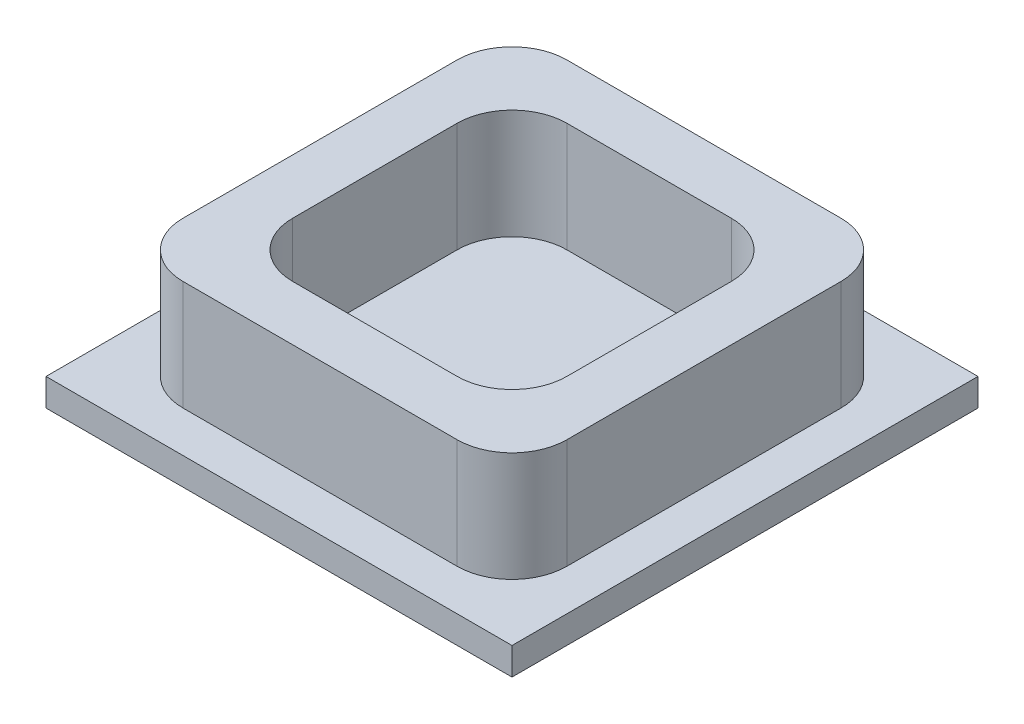
ISO-10303-21;
HEADER;
FILE_DESCRIPTION(('STEP AP214'),'2;1');
FILE_NAME('part.step','',(''),(''),'','','');
FILE_SCHEMA(('AUTOMOTIVE_DESIGN { 1 0 10303 214 1 1 1 1 }'));
ENDSEC;
DATA;
#1=APPLICATION_CONTEXT('core data for automotive mechanical design processes');
#2=APPLICATION_PROTOCOL_DEFINITION('international standard','automotive_design',2000,#1);
#3=PRODUCT_CONTEXT('',#1,'mechanical');
#4=PRODUCT('Part','Part','',(#3));
#5=PRODUCT_RELATED_PRODUCT_CATEGORY('part','',(#4));
#6=PRODUCT_DEFINITION_FORMATION('','',#4);
#7=PRODUCT_DEFINITION_CONTEXT('part definition',#1,'design');
#8=PRODUCT_DEFINITION('design','',#6,#7);
#9=PRODUCT_DEFINITION_SHAPE('','',#8);
#10=(LENGTH_UNIT() NAMED_UNIT(*) SI_UNIT(.MILLI.,.METRE.));
#11=(NAMED_UNIT(*) PLANE_ANGLE_UNIT() SI_UNIT($,.RADIAN.));
#12=(NAMED_UNIT(*) SI_UNIT($,.STERADIAN.) SOLID_ANGLE_UNIT());
#13=UNCERTAINTY_MEASURE_WITH_UNIT(LENGTH_MEASURE(1.E-05),#10,'distance_accuracy_value','');
#14=(GEOMETRIC_REPRESENTATION_CONTEXT(3) GLOBAL_UNCERTAINTY_ASSIGNED_CONTEXT((#13)) GLOBAL_UNIT_ASSIGNED_CONTEXT((#10,
#11,#12)) REPRESENTATION_CONTEXT('',''));
#15=CARTESIAN_POINT('',(0.,0.,0.));
#16=DIRECTION('',(0.,0.,1.));
#17=DIRECTION('',(1.,0.,0.));
#18=AXIS2_PLACEMENT_3D('',#15,#16,#17);
#19=CARTESIAN_POINT('',(0.,1.,0.));
#20=DIRECTION('',(0.,1.,0.));
#21=DIRECTION('',(0.,0.,1.));
#22=AXIS2_PLACEMENT_3D('',#19,#20,#21);
#23=PLANE('',#22);
#24=DIRECTION('',(0.,0.,1.));
#25=VECTOR('',#24,1.);
#26=CARTESIAN_POINT('',(-8.5,1.,8.5));
#27=LINE('',#26,#25);
#28=CARTESIAN_POINT('',(-8.5,1.,-8.5));
#29=VERTEX_POINT('',#28);
#30=CARTESIAN_POINT('',(-8.5,1.,8.5));
#31=VERTEX_POINT('',#30);
#32=EDGE_CURVE('E180',#29,#31,#27,.T.);
#33=ORIENTED_EDGE('',*,*,#32,.T.);
#34=DIRECTION('',(1.,0.,0.));
#35=VECTOR('',#34,1.);
#36=CARTESIAN_POINT('',(8.5,1.,8.5));
#37=LINE('',#36,#35);
#38=CARTESIAN_POINT('',(8.5,1.,8.5));
#39=VERTEX_POINT('',#38);
#40=EDGE_CURVE('E169',#31,#39,#37,.T.);
#41=ORIENTED_EDGE('',*,*,#40,.T.);
#42=DIRECTION('',(0.,0.,-1.));
#43=VECTOR('',#42,1.);
#44=CARTESIAN_POINT('',(8.5,1.,8.5));
#45=LINE('',#44,#43);
#46=CARTESIAN_POINT('',(8.5,1.,-8.5));
#47=VERTEX_POINT('',#46);
#48=EDGE_CURVE('E179',#39,#47,#45,.T.);
#49=ORIENTED_EDGE('',*,*,#48,.T.);
#50=DIRECTION('',(-1.,0.,0.));
#51=VECTOR('',#50,1.);
#52=CARTESIAN_POINT('',(8.5,1.,-8.5));
#53=LINE('',#52,#51);
#54=EDGE_CURVE('E184',#47,#29,#53,.T.);
#55=ORIENTED_EDGE('',*,*,#54,.T.);
#56=EDGE_LOOP('',(#33,#41,#49,#55));
#57=FACE_BOUND('',#56,.T.);
#58=DIRECTION('',(-1.,0.,0.));
#59=VECTOR('',#58,1.);
#60=CARTESIAN_POINT('',(-7.,1.,-7.));
#61=LINE('',#60,#59);
#62=CARTESIAN_POINT('',(5.,1.,-7.));
#63=VERTEX_POINT('',#62);
#64=CARTESIAN_POINT('',(-5.,1.,-7.));
#65=VERTEX_POINT('',#64);
#66=EDGE_CURVE('E267',#63,#65,#61,.T.);
#67=ORIENTED_EDGE('',*,*,#66,.F.);
#68=CARTESIAN_POINT('',(5.,1.,-5.));
#69=DIRECTION('',(0.,1.,0.));
#70=DIRECTION('',(0.,0.,1.));
#71=AXIS2_PLACEMENT_3D('',#68,#69,#70);
#72=CIRCLE('',#71,2.);
#73=CARTESIAN_POINT('',(7.,1.,-5.));
#74=VERTEX_POINT('',#73);
#75=EDGE_CURVE('E41',#63,#74,#72,.F.);
#76=ORIENTED_EDGE('',*,*,#75,.T.);
#77=DIRECTION('',(0.,0.,-1.));
#78=VECTOR('',#77,1.);
#79=CARTESIAN_POINT('',(7.,1.,-7.));
#80=LINE('',#79,#78);
#81=CARTESIAN_POINT('',(7.,1.,5.));
#82=VERTEX_POINT('',#81);
#83=EDGE_CURVE('E266',#82,#74,#80,.T.);
#84=ORIENTED_EDGE('',*,*,#83,.F.);
#85=CARTESIAN_POINT('',(5.,1.,5.));
#86=DIRECTION('',(0.,1.,0.));
#87=DIRECTION('',(0.,0.,1.));
#88=AXIS2_PLACEMENT_3D('',#85,#86,#87);
#89=CIRCLE('',#88,2.);
#90=CARTESIAN_POINT('',(5.,1.,7.));
#91=VERTEX_POINT('',#90);
#92=EDGE_CURVE('E263',#82,#91,#89,.F.);
#93=ORIENTED_EDGE('',*,*,#92,.T.);
#94=DIRECTION('',(1.,0.,0.));
#95=VECTOR('',#94,1.);
#96=CARTESIAN_POINT('',(-7.,1.,7.));
#97=LINE('',#96,#95);
#98=CARTESIAN_POINT('',(-5.,1.,7.));
#99=VERTEX_POINT('',#98);
#100=EDGE_CURVE('E293',#99,#91,#97,.T.);
#101=ORIENTED_EDGE('',*,*,#100,.F.);
#102=CARTESIAN_POINT('',(-5.,1.,5.));
#103=DIRECTION('',(0.,1.,0.));
#104=DIRECTION('',(0.,0.,1.));
#105=AXIS2_PLACEMENT_3D('',#102,#103,#104);
#106=CIRCLE('',#105,2.);
#107=CARTESIAN_POINT('',(-7.,1.,5.));
#108=VERTEX_POINT('',#107);
#109=EDGE_CURVE('E261',#99,#108,#106,.F.);
#110=ORIENTED_EDGE('',*,*,#109,.T.);
#111=DIRECTION('',(0.,0.,1.));
#112=VECTOR('',#111,1.);
#113=CARTESIAN_POINT('',(-7.,1.,-7.));
#114=LINE('',#113,#112);
#115=CARTESIAN_POINT('',(-7.,1.,-5.));
#116=VERTEX_POINT('',#115);
#117=EDGE_CURVE('E300',#116,#108,#114,.T.);
#118=ORIENTED_EDGE('',*,*,#117,.F.);
#119=CARTESIAN_POINT('',(-5.,1.,-5.));
#120=DIRECTION('',(0.,1.,0.));
#121=DIRECTION('',(0.,0.,1.));
#122=AXIS2_PLACEMENT_3D('',#119,#120,#121);
#123=CIRCLE('',#122,2.);
#124=EDGE_CURVE('E11',#116,#65,#123,.F.);
#125=ORIENTED_EDGE('',*,*,#124,.T.);
#126=EDGE_LOOP('',(#67,#76,#84,#93,#101,#110,#118,#125));
#127=FACE_BOUND('',#126,.T.);
#128=ADVANCED_FACE('F33',(#57,#127),#23,.T.);
#129=CARTESIAN_POINT('',(-8.5,1.,8.5));
#130=DIRECTION('',(1.,0.,0.));
#131=DIRECTION('',(0.,0.,-1.));
#132=AXIS2_PLACEMENT_3D('',#129,#130,#131);
#133=PLANE('',#132);
#134=DIRECTION('',(0.,0.,1.));
#135=VECTOR('',#134,1.);
#136=CARTESIAN_POINT('',(-8.5,0.,8.5));
#137=LINE('',#136,#135);
#138=CARTESIAN_POINT('',(-8.5,0.,-8.5));
#139=VERTEX_POINT('',#138);
#140=CARTESIAN_POINT('',(-8.5,0.,8.5));
#141=VERTEX_POINT('',#140);
#142=EDGE_CURVE('E192',#139,#141,#137,.T.);
#143=ORIENTED_EDGE('',*,*,#142,.T.);
#144=DIRECTION('',(0.,-1.,0.));
#145=VECTOR('',#144,1.);
#146=CARTESIAN_POINT('',(-8.5,1.,8.5));
#147=LINE('',#146,#145);
#148=EDGE_CURVE('E173',#31,#141,#147,.T.);
#149=ORIENTED_EDGE('',*,*,#148,.F.);
#150=ORIENTED_EDGE('',*,*,#32,.F.);
#151=DIRECTION('',(0.,-1.,0.));
#152=VECTOR('',#151,1.);
#153=CARTESIAN_POINT('',(-8.5,1.,-8.5));
#154=LINE('',#153,#152);
#155=EDGE_CURVE('E307',#29,#139,#154,.T.);
#156=ORIENTED_EDGE('',*,*,#155,.T.);
#157=EDGE_LOOP('',(#143,#149,#150,#156));
#158=FACE_BOUND('',#157,.T.);
#159=ADVANCED_FACE('F190',(#158),#133,.F.);
#160=CARTESIAN_POINT('',(8.5,1.,8.5));
#161=DIRECTION('',(0.,0.,-1.));
#162=DIRECTION('',(-1.,0.,0.));
#163=AXIS2_PLACEMENT_3D('',#160,#161,#162);
#164=PLANE('',#163);
#165=DIRECTION('',(1.,0.,0.));
#166=VECTOR('',#165,1.);
#167=CARTESIAN_POINT('',(8.5,0.,8.5));
#168=LINE('',#167,#166);
#169=CARTESIAN_POINT('',(8.5,0.,8.5));
#170=VERTEX_POINT('',#169);
#171=EDGE_CURVE('E309',#141,#170,#168,.T.);
#172=ORIENTED_EDGE('',*,*,#171,.T.);
#173=DIRECTION('',(0.,-1.,0.));
#174=VECTOR('',#173,1.);
#175=CARTESIAN_POINT('',(8.5,1.,8.5));
#176=LINE('',#175,#174);
#177=EDGE_CURVE('E176',#39,#170,#176,.T.);
#178=ORIENTED_EDGE('',*,*,#177,.F.);
#179=ORIENTED_EDGE('',*,*,#40,.F.);
#180=ORIENTED_EDGE('',*,*,#148,.T.);
#181=EDGE_LOOP('',(#172,#178,#179,#180));
#182=FACE_BOUND('',#181,.T.);
#183=ADVANCED_FACE('F171',(#182),#164,.F.);
#184=CARTESIAN_POINT('',(8.5,1.,8.5));
#185=DIRECTION('',(-1.,0.,0.));
#186=DIRECTION('',(0.,0.,1.));
#187=AXIS2_PLACEMENT_3D('',#184,#185,#186);
#188=PLANE('',#187);
#189=DIRECTION('',(0.,0.,-1.));
#190=VECTOR('',#189,1.);
#191=CARTESIAN_POINT('',(8.5,0.,8.5));
#192=LINE('',#191,#190);
#193=CARTESIAN_POINT('',(8.5,0.,-8.5));
#194=VERTEX_POINT('',#193);
#195=EDGE_CURVE('E311',#170,#194,#192,.T.);
#196=ORIENTED_EDGE('',*,*,#195,.T.);
#197=DIRECTION('',(0.,-1.,0.));
#198=VECTOR('',#197,1.);
#199=CARTESIAN_POINT('',(8.5,1.,-8.5));
#200=LINE('',#199,#198);
#201=EDGE_CURVE('E197',#47,#194,#200,.T.);
#202=ORIENTED_EDGE('',*,*,#201,.F.);
#203=ORIENTED_EDGE('',*,*,#48,.F.);
#204=ORIENTED_EDGE('',*,*,#177,.T.);
#205=EDGE_LOOP('',(#196,#202,#203,#204));
#206=FACE_BOUND('',#205,.T.);
#207=ADVANCED_FACE('F323',(#206),#188,.F.);
#208=CARTESIAN_POINT('',(8.5,1.,-8.5));
#209=DIRECTION('',(0.,0.,1.));
#210=DIRECTION('',(1.,0.,0.));
#211=AXIS2_PLACEMENT_3D('',#208,#209,#210);
#212=PLANE('',#211);
#213=DIRECTION('',(-1.,0.,0.));
#214=VECTOR('',#213,1.);
#215=CARTESIAN_POINT('',(8.5,0.,-8.5));
#216=LINE('',#215,#214);
#217=EDGE_CURVE('E188',#194,#139,#216,.T.);
#218=ORIENTED_EDGE('',*,*,#217,.T.);
#219=ORIENTED_EDGE('',*,*,#155,.F.);
#220=ORIENTED_EDGE('',*,*,#54,.F.);
#221=ORIENTED_EDGE('',*,*,#201,.T.);
#222=EDGE_LOOP('',(#218,#219,#220,#221));
#223=FACE_BOUND('',#222,.T.);
#224=ADVANCED_FACE('F318',(#223),#212,.F.);
#225=CARTESIAN_POINT('',(0.,0.,0.));
#226=DIRECTION('',(0.,1.,0.));
#227=DIRECTION('',(0.,0.,1.));
#228=AXIS2_PLACEMENT_3D('',#225,#226,#227);
#229=PLANE('',#228);
#230=ORIENTED_EDGE('',*,*,#142,.F.);
#231=ORIENTED_EDGE('',*,*,#217,.F.);
#232=ORIENTED_EDGE('',*,*,#195,.F.);
#233=ORIENTED_EDGE('',*,*,#171,.F.);
#234=EDGE_LOOP('',(#230,#231,#232,#233));
#235=FACE_BOUND('',#234,.T.);
#236=ADVANCED_FACE('F322',(#235),#229,.F.);
#237=CARTESIAN_POINT('',(0.,5.,0.));
#238=DIRECTION('',(0.,1.,0.));
#239=DIRECTION('',(0.,0.,1.));
#240=AXIS2_PLACEMENT_3D('',#237,#238,#239);
#241=PLANE('',#240);
#242=DIRECTION('',(0.,0.,1.));
#243=VECTOR('',#242,1.);
#244=CARTESIAN_POINT('',(-7.,5.,-7.));
#245=LINE('',#244,#243);
#246=CARTESIAN_POINT('',(-7.,5.,-5.));
#247=VERTEX_POINT('',#246);
#248=CARTESIAN_POINT('',(-7.,5.,5.));
#249=VERTEX_POINT('',#248);
#250=EDGE_CURVE('E289',#247,#249,#245,.T.);
#251=ORIENTED_EDGE('',*,*,#250,.T.);
#252=CARTESIAN_POINT('',(-5.,5.,5.));
#253=DIRECTION('',(0.,1.,0.));
#254=DIRECTION('',(0.,0.,1.));
#255=AXIS2_PLACEMENT_3D('',#252,#253,#254);
#256=CIRCLE('',#255,2.);
#257=CARTESIAN_POINT('',(-5.,5.,7.));
#258=VERTEX_POINT('',#257);
#259=EDGE_CURVE('E242',#249,#258,#256,.T.);
#260=ORIENTED_EDGE('',*,*,#259,.T.);
#261=DIRECTION('',(1.,0.,0.));
#262=VECTOR('',#261,1.);
#263=CARTESIAN_POINT('',(-7.,5.,7.));
#264=LINE('',#263,#262);
#265=CARTESIAN_POINT('',(5.,5.,7.));
#266=VERTEX_POINT('',#265);
#267=EDGE_CURVE('E291',#258,#266,#264,.T.);
#268=ORIENTED_EDGE('',*,*,#267,.T.);
#269=CARTESIAN_POINT('',(5.,5.,5.));
#270=DIRECTION('',(0.,1.,0.));
#271=DIRECTION('',(0.,0.,1.));
#272=AXIS2_PLACEMENT_3D('',#269,#270,#271);
#273=CIRCLE('',#272,2.);
#274=CARTESIAN_POINT('',(7.,5.,5.));
#275=VERTEX_POINT('',#274);
#276=EDGE_CURVE('E240',#266,#275,#273,.T.);
#277=ORIENTED_EDGE('',*,*,#276,.T.);
#278=DIRECTION('',(0.,0.,-1.));
#279=VECTOR('',#278,1.);
#280=CARTESIAN_POINT('',(7.,5.,-7.));
#281=LINE('',#280,#279);
#282=CARTESIAN_POINT('',(7.,5.,-5.));
#283=VERTEX_POINT('',#282);
#284=EDGE_CURVE('E285',#275,#283,#281,.T.);
#285=ORIENTED_EDGE('',*,*,#284,.T.);
#286=CARTESIAN_POINT('',(5.,5.,-5.));
#287=DIRECTION('',(0.,1.,0.));
#288=DIRECTION('',(0.,0.,1.));
#289=AXIS2_PLACEMENT_3D('',#286,#287,#288);
#290=CIRCLE('',#289,2.);
#291=CARTESIAN_POINT('',(5.,5.,-7.));
#292=VERTEX_POINT('',#291);
#293=EDGE_CURVE('E238',#283,#292,#290,.T.);
#294=ORIENTED_EDGE('',*,*,#293,.T.);
#295=DIRECTION('',(-1.,0.,0.));
#296=VECTOR('',#295,1.);
#297=CARTESIAN_POINT('',(-7.,5.,-7.));
#298=LINE('',#297,#296);
#299=CARTESIAN_POINT('',(-5.,5.,-7.));
#300=VERTEX_POINT('',#299);
#301=EDGE_CURVE('E283',#292,#300,#298,.T.);
#302=ORIENTED_EDGE('',*,*,#301,.T.);
#303=CARTESIAN_POINT('',(-5.,5.,-5.));
#304=DIRECTION('',(0.,1.,0.));
#305=DIRECTION('',(0.,0.,1.));
#306=AXIS2_PLACEMENT_3D('',#303,#304,#305);
#307=CIRCLE('',#306,2.);
#308=EDGE_CURVE('E236',#300,#247,#307,.T.);
#309=ORIENTED_EDGE('',*,*,#308,.T.);
#310=EDGE_LOOP('',(#251,#260,#268,#277,#285,#294,#302,#309));
#311=FACE_BOUND('',#310,.T.);
#312=DIRECTION('',(0.,0.,1.));
#313=VECTOR('',#312,1.);
#314=CARTESIAN_POINT('',(-5.,5.,-5.));
#315=LINE('',#314,#313);
#316=CARTESIAN_POINT('',(-5.,5.,-3.));
#317=VERTEX_POINT('',#316);
#318=CARTESIAN_POINT('',(-5.,5.,3.));
#319=VERTEX_POINT('',#318);
#320=EDGE_CURVE('E374',#317,#319,#315,.T.);
#321=ORIENTED_EDGE('',*,*,#320,.F.);
#322=CARTESIAN_POINT('',(-3.,5.,-3.));
#323=DIRECTION('',(0.,1.,0.));
#324=DIRECTION('',(0.,0.,1.));
#325=AXIS2_PLACEMENT_3D('',#322,#323,#324);
#326=CIRCLE('',#325,2.);
#327=CARTESIAN_POINT('',(-3.,5.,-5.));
#328=VERTEX_POINT('',#327);
#329=EDGE_CURVE('E259',#317,#328,#326,.F.);
#330=ORIENTED_EDGE('',*,*,#329,.T.);
#331=DIRECTION('',(-1.,0.,0.));
#332=VECTOR('',#331,1.);
#333=CARTESIAN_POINT('',(-5.,5.,-5.));
#334=LINE('',#333,#332);
#335=CARTESIAN_POINT('',(3.,5.,-5.));
#336=VERTEX_POINT('',#335);
#337=EDGE_CURVE('E371',#336,#328,#334,.T.);
#338=ORIENTED_EDGE('',*,*,#337,.F.);
#339=CARTESIAN_POINT('',(3.,5.,-3.));
#340=DIRECTION('',(0.,1.,0.));
#341=DIRECTION('',(0.,0.,1.));
#342=AXIS2_PLACEMENT_3D('',#339,#340,#341);
#343=CIRCLE('',#342,2.);
#344=CARTESIAN_POINT('',(5.,5.,-3.));
#345=VERTEX_POINT('',#344);
#346=EDGE_CURVE('E257',#336,#345,#343,.F.);
#347=ORIENTED_EDGE('',*,*,#346,.T.);
#348=DIRECTION('',(0.,0.,-1.));
#349=VECTOR('',#348,1.);
#350=CARTESIAN_POINT('',(5.,5.,-5.));
#351=LINE('',#350,#349);
#352=CARTESIAN_POINT('',(5.,5.,3.));
#353=VERTEX_POINT('',#352);
#354=EDGE_CURVE('E273',#353,#345,#351,.T.);
#355=ORIENTED_EDGE('',*,*,#354,.F.);
#356=CARTESIAN_POINT('',(3.,5.,3.));
#357=DIRECTION('',(0.,1.,0.));
#358=DIRECTION('',(0.,0.,1.));
#359=AXIS2_PLACEMENT_3D('',#356,#357,#358);
#360=CIRCLE('',#359,2.);
#361=CARTESIAN_POINT('',(3.,5.,5.));
#362=VERTEX_POINT('',#361);
#363=EDGE_CURVE('E255',#353,#362,#360,.F.);
#364=ORIENTED_EDGE('',*,*,#363,.T.);
#365=DIRECTION('',(1.,0.,0.));
#366=VECTOR('',#365,1.);
#367=CARTESIAN_POINT('',(-5.,5.,5.));
#368=LINE('',#367,#366);
#369=CARTESIAN_POINT('',(-3.,5.,5.));
#370=VERTEX_POINT('',#369);
#371=EDGE_CURVE('E380',#370,#362,#368,.T.);
#372=ORIENTED_EDGE('',*,*,#371,.F.);
#373=CARTESIAN_POINT('',(-3.,5.,3.));
#374=DIRECTION('',(0.,1.,0.));
#375=DIRECTION('',(0.,0.,1.));
#376=AXIS2_PLACEMENT_3D('',#373,#374,#375);
#377=CIRCLE('',#376,2.);
#378=EDGE_CURVE('E253',#370,#319,#377,.F.);
#379=ORIENTED_EDGE('',*,*,#378,.T.);
#380=EDGE_LOOP('',(#321,#330,#338,#347,#355,#364,#372,#379));
#381=FACE_BOUND('',#380,.T.);
#382=ADVANCED_FACE('F281',(#311,#381),#241,.T.);
#383=CARTESIAN_POINT('',(7.,5.,-7.));
#384=DIRECTION('',(-1.,0.,0.));
#385=DIRECTION('',(0.,0.,1.));
#386=AXIS2_PLACEMENT_3D('',#383,#384,#385);
#387=PLANE('',#386);
#388=ORIENTED_EDGE('',*,*,#284,.F.);
#389=DIRECTION('',(0.,-1.,0.));
#390=VECTOR('',#389,1.);
#391=CARTESIAN_POINT('',(7.,5.,5.));
#392=LINE('',#391,#390);
#393=EDGE_CURVE('E246',#275,#82,#392,.T.);
#394=ORIENTED_EDGE('',*,*,#393,.T.);
#395=ORIENTED_EDGE('',*,*,#83,.T.);
#396=DIRECTION('',(0.,-1.,0.));
#397=VECTOR('',#396,1.);
#398=CARTESIAN_POINT('',(7.,5.,-5.));
#399=LINE('',#398,#397);
#400=EDGE_CURVE('E244',#74,#283,#399,.F.);
#401=ORIENTED_EDGE('',*,*,#400,.T.);
#402=EDGE_LOOP('',(#388,#394,#395,#401));
#403=FACE_BOUND('',#402,.T.);
#404=ADVANCED_FACE('F270',(#403),#387,.F.);
#405=CARTESIAN_POINT('',(-7.,5.,-7.));
#406=DIRECTION('',(0.,0.,1.));
#407=DIRECTION('',(1.,0.,0.));
#408=AXIS2_PLACEMENT_3D('',#405,#406,#407);
#409=PLANE('',#408);
#410=ORIENTED_EDGE('',*,*,#301,.F.);
#411=DIRECTION('',(0.,-1.,0.));
#412=VECTOR('',#411,1.);
#413=CARTESIAN_POINT('',(5.,5.,-7.));
#414=LINE('',#413,#412);
#415=EDGE_CURVE('E251',#292,#63,#414,.T.);
#416=ORIENTED_EDGE('',*,*,#415,.T.);
#417=ORIENTED_EDGE('',*,*,#66,.T.);
#418=DIRECTION('',(0.,-1.,0.));
#419=VECTOR('',#418,1.);
#420=CARTESIAN_POINT('',(-5.,5.,-7.));
#421=LINE('',#420,#419);
#422=EDGE_CURVE('E249',#65,#300,#421,.F.);
#423=ORIENTED_EDGE('',*,*,#422,.T.);
#424=EDGE_LOOP('',(#410,#416,#417,#423));
#425=FACE_BOUND('',#424,.T.);
#426=ADVANCED_FACE('F287',(#425),#409,.F.);
#427=CARTESIAN_POINT('',(-7.,5.,-7.));
#428=DIRECTION('',(1.,0.,0.));
#429=DIRECTION('',(0.,0.,-1.));
#430=AXIS2_PLACEMENT_3D('',#427,#428,#429);
#431=PLANE('',#430);
#432=ORIENTED_EDGE('',*,*,#117,.T.);
#433=DIRECTION('',(0.,-1.,0.));
#434=VECTOR('',#433,1.);
#435=CARTESIAN_POINT('',(-7.,5.,5.));
#436=LINE('',#435,#434);
#437=EDGE_CURVE('E234',#108,#249,#436,.F.);
#438=ORIENTED_EDGE('',*,*,#437,.T.);
#439=ORIENTED_EDGE('',*,*,#250,.F.);
#440=DIRECTION('',(0.,-1.,0.));
#441=VECTOR('',#440,1.);
#442=CARTESIAN_POINT('',(-7.,5.,-5.));
#443=LINE('',#442,#441);
#444=EDGE_CURVE('E231',#247,#116,#443,.T.);
#445=ORIENTED_EDGE('',*,*,#444,.T.);
#446=EDGE_LOOP('',(#432,#438,#439,#445));
#447=FACE_BOUND('',#446,.T.);
#448=ADVANCED_FACE('F434',(#447),#431,.F.);
#449=CARTESIAN_POINT('',(-7.,5.,7.));
#450=DIRECTION('',(0.,0.,-1.));
#451=DIRECTION('',(-1.,0.,0.));
#452=AXIS2_PLACEMENT_3D('',#449,#450,#451);
#453=PLANE('',#452);
#454=ORIENTED_EDGE('',*,*,#267,.F.);
#455=DIRECTION('',(0.,-1.,0.));
#456=VECTOR('',#455,1.);
#457=CARTESIAN_POINT('',(-5.,5.,7.));
#458=LINE('',#457,#456);
#459=EDGE_CURVE('E228',#258,#99,#458,.T.);
#460=ORIENTED_EDGE('',*,*,#459,.T.);
#461=ORIENTED_EDGE('',*,*,#100,.T.);
#462=DIRECTION('',(0.,-1.,0.));
#463=VECTOR('',#462,1.);
#464=CARTESIAN_POINT('',(5.,5.,7.));
#465=LINE('',#464,#463);
#466=EDGE_CURVE('E226',#91,#266,#465,.F.);
#467=ORIENTED_EDGE('',*,*,#466,.T.);
#468=EDGE_LOOP('',(#454,#460,#461,#467));
#469=FACE_BOUND('',#468,.T.);
#470=ADVANCED_FACE('F440',(#469),#453,.F.);
#471=CARTESIAN_POINT('',(-5.,5.,-5.));
#472=DIRECTION('',(0.,0.,1.));
#473=DIRECTION('',(1.,0.,0.));
#474=AXIS2_PLACEMENT_3D('',#471,#472,#473);
#475=PLANE('',#474);
#476=DIRECTION('',(-1.,0.,0.));
#477=VECTOR('',#476,1.);
#478=CARTESIAN_POINT('',(-5.,1.,-5.));
#479=LINE('',#478,#477);
#480=CARTESIAN_POINT('',(3.,1.,-5.));
#481=VERTEX_POINT('',#480);
#482=CARTESIAN_POINT('',(-3.,1.,-5.));
#483=VERTEX_POINT('',#482);
#484=EDGE_CURVE('E364',#481,#483,#479,.T.);
#485=ORIENTED_EDGE('',*,*,#484,.F.);
#486=DIRECTION('',(0.,-1.,0.));
#487=VECTOR('',#486,1.);
#488=CARTESIAN_POINT('',(3.,5.,-5.));
#489=LINE('',#488,#487);
#490=EDGE_CURVE('E224',#481,#336,#489,.F.);
#491=ORIENTED_EDGE('',*,*,#490,.T.);
#492=ORIENTED_EDGE('',*,*,#337,.T.);
#493=DIRECTION('',(0.,-1.,0.));
#494=VECTOR('',#493,1.);
#495=CARTESIAN_POINT('',(-3.,1.,-5.));
#496=LINE('',#495,#494);
#497=EDGE_CURVE('E221',#328,#483,#496,.T.);
#498=ORIENTED_EDGE('',*,*,#497,.T.);
#499=EDGE_LOOP('',(#485,#491,#492,#498));
#500=FACE_BOUND('',#499,.T.);
#501=ADVANCED_FACE('F394',(#500),#475,.T.);
#502=CARTESIAN_POINT('',(-5.,5.,-5.));
#503=DIRECTION('',(1.,0.,0.));
#504=DIRECTION('',(0.,0.,-1.));
#505=AXIS2_PLACEMENT_3D('',#502,#503,#504);
#506=PLANE('',#505);
#507=ORIENTED_EDGE('',*,*,#320,.T.);
#508=DIRECTION('',(0.,-1.,0.));
#509=VECTOR('',#508,1.);
#510=CARTESIAN_POINT('',(-5.,1.,3.));
#511=LINE('',#510,#509);
#512=CARTESIAN_POINT('',(-5.,1.,3.));
#513=VERTEX_POINT('',#512);
#514=EDGE_CURVE('E195',#319,#513,#511,.T.);
#515=ORIENTED_EDGE('',*,*,#514,.T.);
#516=DIRECTION('',(0.,0.,1.));
#517=VECTOR('',#516,1.);
#518=CARTESIAN_POINT('',(-5.,1.,-5.));
#519=LINE('',#518,#517);
#520=CARTESIAN_POINT('',(-5.,1.,-3.));
#521=VERTEX_POINT('',#520);
#522=EDGE_CURVE('E357',#521,#513,#519,.T.);
#523=ORIENTED_EDGE('',*,*,#522,.F.);
#524=DIRECTION('',(0.,-1.,0.));
#525=VECTOR('',#524,1.);
#526=CARTESIAN_POINT('',(-5.,5.,-3.));
#527=LINE('',#526,#525);
#528=EDGE_CURVE('E193',#521,#317,#527,.F.);
#529=ORIENTED_EDGE('',*,*,#528,.T.);
#530=EDGE_LOOP('',(#507,#515,#523,#529));
#531=FACE_BOUND('',#530,.T.);
#532=ADVANCED_FACE('F399',(#531),#506,.T.);
#533=CARTESIAN_POINT('',(-5.,5.,5.));
#534=DIRECTION('',(0.,0.,-1.));
#535=DIRECTION('',(-1.,0.,0.));
#536=AXIS2_PLACEMENT_3D('',#533,#534,#535);
#537=PLANE('',#536);
#538=DIRECTION('',(1.,0.,0.));
#539=VECTOR('',#538,1.);
#540=CARTESIAN_POINT('',(-5.,1.,5.));
#541=LINE('',#540,#539);
#542=CARTESIAN_POINT('',(-3.,1.,5.));
#543=VERTEX_POINT('',#542);
#544=CARTESIAN_POINT('',(3.,1.,5.));
#545=VERTEX_POINT('',#544);
#546=EDGE_CURVE('E363',#543,#545,#541,.T.);
#547=ORIENTED_EDGE('',*,*,#546,.F.);
#548=DIRECTION('',(0.,-1.,0.));
#549=VECTOR('',#548,1.);
#550=CARTESIAN_POINT('',(-3.,5.,5.));
#551=LINE('',#550,#549);
#552=EDGE_CURVE('E214',#543,#370,#551,.F.);
#553=ORIENTED_EDGE('',*,*,#552,.T.);
#554=ORIENTED_EDGE('',*,*,#371,.T.);
#555=DIRECTION('',(0.,-1.,0.));
#556=VECTOR('',#555,1.);
#557=CARTESIAN_POINT('',(3.,1.,5.));
#558=LINE('',#557,#556);
#559=EDGE_CURVE('E211',#362,#545,#558,.T.);
#560=ORIENTED_EDGE('',*,*,#559,.T.);
#561=EDGE_LOOP('',(#547,#553,#554,#560));
#562=FACE_BOUND('',#561,.T.);
#563=ADVANCED_FACE('F352',(#562),#537,.T.);
#564=CARTESIAN_POINT('',(5.,5.,-5.));
#565=DIRECTION('',(-1.,0.,0.));
#566=DIRECTION('',(0.,0.,1.));
#567=AXIS2_PLACEMENT_3D('',#564,#565,#566);
#568=PLANE('',#567);
#569=DIRECTION('',(0.,0.,-1.));
#570=VECTOR('',#569,1.);
#571=CARTESIAN_POINT('',(5.,1.,-5.));
#572=LINE('',#571,#570);
#573=CARTESIAN_POINT('',(5.,1.,3.));
#574=VERTEX_POINT('',#573);
#575=CARTESIAN_POINT('',(5.,1.,-3.));
#576=VERTEX_POINT('',#575);
#577=EDGE_CURVE('E366',#574,#576,#572,.T.);
#578=ORIENTED_EDGE('',*,*,#577,.F.);
#579=DIRECTION('',(0.,-1.,0.));
#580=VECTOR('',#579,1.);
#581=CARTESIAN_POINT('',(5.,5.,3.));
#582=LINE('',#581,#580);
#583=EDGE_CURVE('E219',#574,#353,#582,.F.);
#584=ORIENTED_EDGE('',*,*,#583,.T.);
#585=ORIENTED_EDGE('',*,*,#354,.T.);
#586=DIRECTION('',(0.,-1.,0.));
#587=VECTOR('',#586,1.);
#588=CARTESIAN_POINT('',(5.,1.,-3.));
#589=LINE('',#588,#587);
#590=EDGE_CURVE('E216',#345,#576,#589,.T.);
#591=ORIENTED_EDGE('',*,*,#590,.T.);
#592=EDGE_LOOP('',(#578,#584,#585,#591));
#593=FACE_BOUND('',#592,.T.);
#594=ADVANCED_FACE('F343',(#593),#568,.T.);
#595=ORIENTED_EDGE('',*,*,#522,.T.);
#596=CARTESIAN_POINT('',(-3.,1.,3.));
#597=DIRECTION('',(0.,1.,0.));
#598=DIRECTION('',(0.,0.,1.));
#599=AXIS2_PLACEMENT_3D('',#596,#597,#598);
#600=CIRCLE('',#599,2.);
#601=EDGE_CURVE('E209',#513,#543,#600,.T.);
#602=ORIENTED_EDGE('',*,*,#601,.T.);
#603=ORIENTED_EDGE('',*,*,#546,.T.);
#604=CARTESIAN_POINT('',(3.,1.,3.));
#605=DIRECTION('',(0.,1.,0.));
#606=DIRECTION('',(0.,0.,1.));
#607=AXIS2_PLACEMENT_3D('',#604,#605,#606);
#608=CIRCLE('',#607,2.);
#609=EDGE_CURVE('E207',#545,#574,#608,.T.);
#610=ORIENTED_EDGE('',*,*,#609,.T.);
#611=ORIENTED_EDGE('',*,*,#577,.T.);
#612=CARTESIAN_POINT('',(3.,1.,-3.));
#613=DIRECTION('',(0.,1.,0.));
#614=DIRECTION('',(0.,0.,1.));
#615=AXIS2_PLACEMENT_3D('',#612,#613,#614);
#616=CIRCLE('',#615,2.);
#617=EDGE_CURVE('E205',#576,#481,#616,.T.);
#618=ORIENTED_EDGE('',*,*,#617,.T.);
#619=ORIENTED_EDGE('',*,*,#484,.T.);
#620=CARTESIAN_POINT('',(-3.,1.,-3.));
#621=DIRECTION('',(0.,1.,0.));
#622=DIRECTION('',(0.,0.,1.));
#623=AXIS2_PLACEMENT_3D('',#620,#621,#622);
#624=CIRCLE('',#623,2.);
#625=EDGE_CURVE('E203',#483,#521,#624,.T.);
#626=ORIENTED_EDGE('',*,*,#625,.T.);
#627=EDGE_LOOP('',(#595,#602,#603,#610,#611,#618,#619,#626));
#628=FACE_BOUND('',#627,.T.);
#629=ADVANCED_FACE('F334',(#628),#23,.T.);
#630=CARTESIAN_POINT('',(-3.,5.,3.));
#631=DIRECTION('',(0.,1.,0.));
#632=DIRECTION('',(0.,0.,1.));
#633=AXIS2_PLACEMENT_3D('',#630,#631,#632);
#634=CYLINDRICAL_SURFACE('',#633,2.);
#635=ORIENTED_EDGE('',*,*,#378,.F.);
#636=ORIENTED_EDGE('',*,*,#552,.F.);
#637=ORIENTED_EDGE('',*,*,#601,.F.);
#638=ORIENTED_EDGE('',*,*,#514,.F.);
#639=EDGE_LOOP('',(#635,#636,#637,#638));
#640=FACE_BOUND('',#639,.T.);
#641=ADVANCED_FACE('F342',(#640),#634,.F.);
#642=CARTESIAN_POINT('',(3.,5.,3.));
#643=DIRECTION('',(0.,1.,0.));
#644=DIRECTION('',(0.,0.,1.));
#645=AXIS2_PLACEMENT_3D('',#642,#643,#644);
#646=CYLINDRICAL_SURFACE('',#645,2.);
#647=ORIENTED_EDGE('',*,*,#363,.F.);
#648=ORIENTED_EDGE('',*,*,#583,.F.);
#649=ORIENTED_EDGE('',*,*,#609,.F.);
#650=ORIENTED_EDGE('',*,*,#559,.F.);
#651=EDGE_LOOP('',(#647,#648,#649,#650));
#652=FACE_BOUND('',#651,.T.);
#653=ADVANCED_FACE('F349',(#652),#646,.F.);
#654=CARTESIAN_POINT('',(3.,5.,-3.));
#655=DIRECTION('',(0.,1.,0.));
#656=DIRECTION('',(0.,0.,1.));
#657=AXIS2_PLACEMENT_3D('',#654,#655,#656);
#658=CYLINDRICAL_SURFACE('',#657,2.);
#659=ORIENTED_EDGE('',*,*,#346,.F.);
#660=ORIENTED_EDGE('',*,*,#490,.F.);
#661=ORIENTED_EDGE('',*,*,#617,.F.);
#662=ORIENTED_EDGE('',*,*,#590,.F.);
#663=EDGE_LOOP('',(#659,#660,#661,#662));
#664=FACE_BOUND('',#663,.T.);
#665=ADVANCED_FACE('F391',(#664),#658,.F.);
#666=CARTESIAN_POINT('',(-3.,5.,-3.));
#667=DIRECTION('',(0.,1.,0.));
#668=DIRECTION('',(0.,0.,1.));
#669=AXIS2_PLACEMENT_3D('',#666,#667,#668);
#670=CYLINDRICAL_SURFACE('',#669,2.);
#671=ORIENTED_EDGE('',*,*,#329,.F.);
#672=ORIENTED_EDGE('',*,*,#528,.F.);
#673=ORIENTED_EDGE('',*,*,#625,.F.);
#674=ORIENTED_EDGE('',*,*,#497,.F.);
#675=EDGE_LOOP('',(#671,#672,#673,#674));
#676=FACE_BOUND('',#675,.T.);
#677=ADVANCED_FACE('F397',(#676),#670,.F.);
#678=CARTESIAN_POINT('',(-5.,5.,5.));
#679=DIRECTION('',(0.,-1.,0.));
#680=DIRECTION('',(0.,0.,-1.));
#681=AXIS2_PLACEMENT_3D('',#678,#679,#680);
#682=CYLINDRICAL_SURFACE('',#681,2.);
#683=ORIENTED_EDGE('',*,*,#259,.F.);
#684=ORIENTED_EDGE('',*,*,#437,.F.);
#685=ORIENTED_EDGE('',*,*,#109,.F.);
#686=ORIENTED_EDGE('',*,*,#459,.F.);
#687=EDGE_LOOP('',(#683,#684,#685,#686));
#688=FACE_BOUND('',#687,.T.);
#689=ADVANCED_FACE('F416',(#688),#682,.T.);
#690=CARTESIAN_POINT('',(5.,5.,5.));
#691=DIRECTION('',(0.,-1.,0.));
#692=DIRECTION('',(0.,0.,-1.));
#693=AXIS2_PLACEMENT_3D('',#690,#691,#692);
#694=CYLINDRICAL_SURFACE('',#693,2.);
#695=ORIENTED_EDGE('',*,*,#276,.F.);
#696=ORIENTED_EDGE('',*,*,#466,.F.);
#697=ORIENTED_EDGE('',*,*,#92,.F.);
#698=ORIENTED_EDGE('',*,*,#393,.F.);
#699=EDGE_LOOP('',(#695,#696,#697,#698));
#700=FACE_BOUND('',#699,.T.);
#701=ADVANCED_FACE('F419',(#700),#694,.T.);
#702=CARTESIAN_POINT('',(5.,5.,-5.));
#703=DIRECTION('',(0.,-1.,0.));
#704=DIRECTION('',(0.,0.,-1.));
#705=AXIS2_PLACEMENT_3D('',#702,#703,#704);
#706=CYLINDRICAL_SURFACE('',#705,2.);
#707=ORIENTED_EDGE('',*,*,#293,.F.);
#708=ORIENTED_EDGE('',*,*,#400,.F.);
#709=ORIENTED_EDGE('',*,*,#75,.F.);
#710=ORIENTED_EDGE('',*,*,#415,.F.);
#711=EDGE_LOOP('',(#707,#708,#709,#710));
#712=FACE_BOUND('',#711,.T.);
#713=ADVANCED_FACE('F276',(#712),#706,.T.);
#714=CARTESIAN_POINT('',(-5.,5.,-5.));
#715=DIRECTION('',(0.,-1.,0.));
#716=DIRECTION('',(0.,0.,-1.));
#717=AXIS2_PLACEMENT_3D('',#714,#715,#716);
#718=CYLINDRICAL_SURFACE('',#717,2.);
#719=ORIENTED_EDGE('',*,*,#308,.F.);
#720=ORIENTED_EDGE('',*,*,#422,.F.);
#721=ORIENTED_EDGE('',*,*,#124,.F.);
#722=ORIENTED_EDGE('',*,*,#444,.F.);
#723=EDGE_LOOP('',(#719,#720,#721,#722));
#724=FACE_BOUND('',#723,.T.);
#725=ADVANCED_FACE('F35',(#724),#718,.T.);
#726=CLOSED_SHELL('',(#128,#159,#183,#207,#224,#236,#382,#404,#426,#448,#470,#501,#532,#563,
#594,#629,#641,#653,#665,#677,#689,#701,#713,#725));
#727=MANIFOLD_SOLID_BREP('B2',#726);
#728=ADVANCED_BREP_SHAPE_REPRESENTATION('',(#18,#727),#14);
#729=SHAPE_DEFINITION_REPRESENTATION(#9,#728);
ENDSEC;
END-ISO-10303-21;
